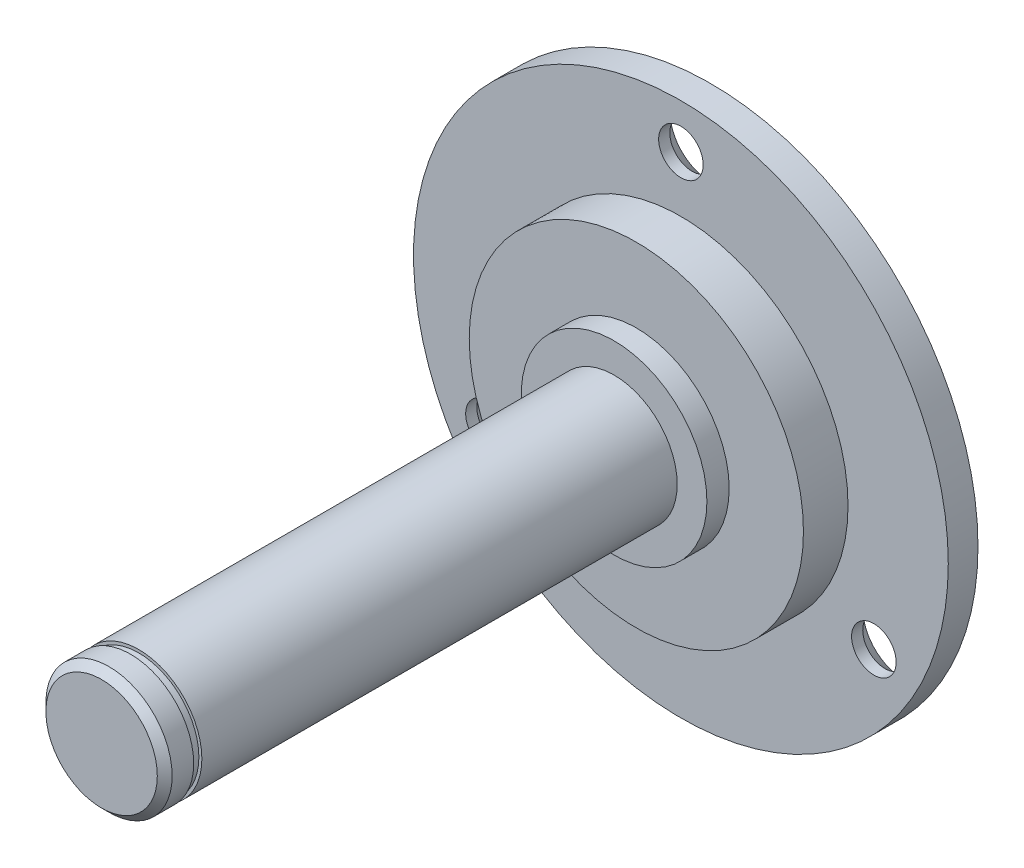
ISO-10303-21;
HEADER;
FILE_DESCRIPTION(('STEP AP214'),'2;1');
FILE_NAME('part.step','',(''),(''),'','','');
FILE_SCHEMA(('AUTOMOTIVE_DESIGN { 1 0 10303 214 1 1 1 1 }'));
ENDSEC;
DATA;
#1=APPLICATION_CONTEXT('core data for automotive mechanical design processes');
#2=APPLICATION_PROTOCOL_DEFINITION('international standard','automotive_design',2000,#1);
#3=PRODUCT_CONTEXT('',#1,'mechanical');
#4=PRODUCT('Part','Part','',(#3));
#5=PRODUCT_RELATED_PRODUCT_CATEGORY('part','',(#4));
#6=PRODUCT_DEFINITION_FORMATION('','',#4);
#7=PRODUCT_DEFINITION_CONTEXT('part definition',#1,'design');
#8=PRODUCT_DEFINITION('design','',#6,#7);
#9=PRODUCT_DEFINITION_SHAPE('','',#8);
#10=(LENGTH_UNIT() NAMED_UNIT(*) SI_UNIT(.MILLI.,.METRE.));
#11=(NAMED_UNIT(*) PLANE_ANGLE_UNIT() SI_UNIT($,.RADIAN.));
#12=(NAMED_UNIT(*) SI_UNIT($,.STERADIAN.) SOLID_ANGLE_UNIT());
#13=UNCERTAINTY_MEASURE_WITH_UNIT(LENGTH_MEASURE(1.E-05),#10,'distance_accuracy_value','');
#14=(GEOMETRIC_REPRESENTATION_CONTEXT(3) GLOBAL_UNCERTAINTY_ASSIGNED_CONTEXT((#13)) GLOBAL_UNIT_ASSIGNED_CONTEXT((#10,
#11,#12)) REPRESENTATION_CONTEXT('',''));
#15=CARTESIAN_POINT('',(0.,0.,0.));
#16=DIRECTION('',(0.,0.,1.));
#17=DIRECTION('',(1.,0.,0.));
#18=AXIS2_PLACEMENT_3D('',#15,#16,#17);
#19=CARTESIAN_POINT('',(0.,0.,0.));
#20=DIRECTION('',(0.,0.,1.));
#21=DIRECTION('',(1.,0.,0.));
#22=AXIS2_PLACEMENT_3D('',#19,#20,#21);
#23=PLANE('',#22);
#24=CARTESIAN_POINT('',(0.,0.,0.));
#25=DIRECTION('',(0.,0.,1.));
#26=DIRECTION('',(1.,0.,0.));
#27=AXIS2_PLACEMENT_3D('',#24,#25,#26);
#28=CIRCLE('',#27,36.);
#29=CARTESIAN_POINT('',(36.,0.,0.));
#30=VERTEX_POINT('',#29);
#31=EDGE_CURVE('E169',#30,#30,#28,.T.);
#32=ORIENTED_EDGE('',*,*,#31,.F.);
#33=EDGE_LOOP('',(#32));
#34=FACE_BOUND('',#33,.T.);
#35=CARTESIAN_POINT('',(-25.9807621135331,-15.0000000000001,0.));
#36=DIRECTION('',(0.,0.,-1.));
#37=DIRECTION('',(-1.,0.,0.));
#38=AXIS2_PLACEMENT_3D('',#35,#36,#37);
#39=CIRCLE('',#38,5.5);
#40=CARTESIAN_POINT('',(-31.4807621135331,-15.0000000000001,0.));
#41=VERTEX_POINT('',#40);
#42=EDGE_CURVE('E134',#41,#41,#39,.T.);
#43=ORIENTED_EDGE('',*,*,#42,.F.);
#44=EDGE_LOOP('',(#43));
#45=FACE_BOUND('',#44,.T.);
#46=CARTESIAN_POINT('',(25.9807621135333,-14.9999999999998,0.));
#47=DIRECTION('',(0.,0.,-1.));
#48=DIRECTION('',(-1.,0.,0.));
#49=AXIS2_PLACEMENT_3D('',#46,#47,#48);
#50=CIRCLE('',#49,5.5);
#51=CARTESIAN_POINT('',(20.4807621135333,-14.9999999999998,0.));
#52=VERTEX_POINT('',#51);
#53=EDGE_CURVE('E125',#52,#52,#50,.T.);
#54=ORIENTED_EDGE('',*,*,#53,.F.);
#55=EDGE_LOOP('',(#54));
#56=FACE_BOUND('',#55,.T.);
#57=CARTESIAN_POINT('',(0.,30.,0.));
#58=DIRECTION('',(0.,0.,-1.));
#59=DIRECTION('',(-1.,0.,0.));
#60=AXIS2_PLACEMENT_3D('',#57,#58,#59);
#61=CIRCLE('',#60,5.5);
#62=CARTESIAN_POINT('',(-5.5,30.,0.));
#63=VERTEX_POINT('',#62);
#64=EDGE_CURVE('E113',#63,#63,#61,.T.);
#65=ORIENTED_EDGE('',*,*,#64,.F.);
#66=EDGE_LOOP('',(#65));
#67=FACE_BOUND('',#66,.T.);
#68=ADVANCED_FACE('F43',(#34,#45,#56,#67),#23,.F.);
#69=CARTESIAN_POINT('',(0.,0.,4.));
#70=DIRECTION('',(0.,0.,-1.));
#71=DIRECTION('',(-1.,0.,0.));
#72=AXIS2_PLACEMENT_3D('',#69,#70,#71);
#73=CYLINDRICAL_SURFACE('',#72,36.);
#74=CARTESIAN_POINT('',(0.,0.,4.));
#75=DIRECTION('',(0.,0.,1.));
#76=DIRECTION('',(1.,0.,0.));
#77=AXIS2_PLACEMENT_3D('',#74,#75,#76);
#78=CIRCLE('',#77,36.);
#79=CARTESIAN_POINT('',(36.,0.,4.));
#80=VERTEX_POINT('',#79);
#81=EDGE_CURVE('E172',#80,#80,#78,.T.);
#82=ORIENTED_EDGE('',*,*,#81,.F.);
#83=EDGE_LOOP('',(#82));
#84=FACE_BOUND('',#83,.T.);
#85=ORIENTED_EDGE('',*,*,#31,.T.);
#86=EDGE_LOOP('',(#85));
#87=FACE_BOUND('',#86,.T.);
#88=ADVANCED_FACE('F257',(#84,#87),#73,.T.);
#89=CARTESIAN_POINT('',(0.,0.,4.));
#90=DIRECTION('',(0.,0.,1.));
#91=DIRECTION('',(1.,0.,0.));
#92=AXIS2_PLACEMENT_3D('',#89,#90,#91);
#93=PLANE('',#92);
#94=CARTESIAN_POINT('',(0.,30.,4.));
#95=DIRECTION('',(0.,0.,1.));
#96=DIRECTION('',(1.,0.,0.));
#97=AXIS2_PLACEMENT_3D('',#94,#95,#96);
#98=CIRCLE('',#97,3.);
#99=CARTESIAN_POINT('',(3.,30.,4.));
#100=VERTEX_POINT('',#99);
#101=EDGE_CURVE('E122',#100,#100,#98,.T.);
#102=ORIENTED_EDGE('',*,*,#101,.F.);
#103=EDGE_LOOP('',(#102));
#104=FACE_BOUND('',#103,.T.);
#105=CARTESIAN_POINT('',(25.9807621135333,-14.9999999999998,4.));
#106=DIRECTION('',(0.,0.,1.));
#107=DIRECTION('',(1.,0.,0.));
#108=AXIS2_PLACEMENT_3D('',#105,#106,#107);
#109=CIRCLE('',#108,3.);
#110=CARTESIAN_POINT('',(28.9807621135333,-14.9999999999998,4.));
#111=VERTEX_POINT('',#110);
#112=EDGE_CURVE('E131',#111,#111,#109,.T.);
#113=ORIENTED_EDGE('',*,*,#112,.F.);
#114=EDGE_LOOP('',(#113));
#115=FACE_BOUND('',#114,.T.);
#116=CARTESIAN_POINT('',(-25.9807621135331,-15.0000000000001,4.));
#117=DIRECTION('',(0.,0.,1.));
#118=DIRECTION('',(1.,0.,0.));
#119=AXIS2_PLACEMENT_3D('',#116,#117,#118);
#120=CIRCLE('',#119,3.);
#121=CARTESIAN_POINT('',(-22.9807621135331,-15.0000000000001,4.));
#122=VERTEX_POINT('',#121);
#123=EDGE_CURVE('E140',#122,#122,#120,.T.);
#124=ORIENTED_EDGE('',*,*,#123,.F.);
#125=EDGE_LOOP('',(#124));
#126=FACE_BOUND('',#125,.T.);
#127=CARTESIAN_POINT('',(0.,0.,4.));
#128=DIRECTION('',(0.,0.,1.));
#129=DIRECTION('',(1.,0.,0.));
#130=AXIS2_PLACEMENT_3D('',#127,#128,#129);
#131=CIRCLE('',#130,22.5);
#132=CARTESIAN_POINT('',(22.5,0.,4.));
#133=VERTEX_POINT('',#132);
#134=EDGE_CURVE('E166',#133,#133,#131,.T.);
#135=ORIENTED_EDGE('',*,*,#134,.F.);
#136=EDGE_LOOP('',(#135));
#137=FACE_BOUND('',#136,.T.);
#138=ORIENTED_EDGE('',*,*,#81,.T.);
#139=EDGE_LOOP('',(#138));
#140=FACE_BOUND('',#139,.T.);
#141=ADVANCED_FACE('F265',(#104,#115,#126,#137,#140),#93,.T.);
#142=CARTESIAN_POINT('',(0.,0.,10.));
#143=DIRECTION('',(0.,0.,-1.));
#144=DIRECTION('',(-1.,0.,0.));
#145=AXIS2_PLACEMENT_3D('',#142,#143,#144);
#146=CYLINDRICAL_SURFACE('',#145,22.5);
#147=CARTESIAN_POINT('',(0.,0.,10.));
#148=DIRECTION('',(0.,0.,1.));
#149=DIRECTION('',(1.,0.,0.));
#150=AXIS2_PLACEMENT_3D('',#147,#148,#149);
#151=CIRCLE('',#150,22.5);
#152=CARTESIAN_POINT('',(22.5,0.,10.));
#153=VERTEX_POINT('',#152);
#154=EDGE_CURVE('E163',#153,#153,#151,.T.);
#155=ORIENTED_EDGE('',*,*,#154,.F.);
#156=EDGE_LOOP('',(#155));
#157=FACE_BOUND('',#156,.T.);
#158=ORIENTED_EDGE('',*,*,#134,.T.);
#159=EDGE_LOOP('',(#158));
#160=FACE_BOUND('',#159,.T.);
#161=ADVANCED_FACE('F271',(#157,#160),#146,.T.);
#162=CARTESIAN_POINT('',(0.,0.,10.));
#163=DIRECTION('',(0.,0.,1.));
#164=DIRECTION('',(1.,0.,0.));
#165=AXIS2_PLACEMENT_3D('',#162,#163,#164);
#166=PLANE('',#165);
#167=CARTESIAN_POINT('',(0.,0.,10.));
#168=DIRECTION('',(0.,0.,1.));
#169=DIRECTION('',(1.,0.,0.));
#170=AXIS2_PLACEMENT_3D('',#167,#168,#169);
#171=CIRCLE('',#170,12.5);
#172=CARTESIAN_POINT('',(12.5,0.,10.));
#173=VERTEX_POINT('',#172);
#174=EDGE_CURVE('E160',#173,#173,#171,.T.);
#175=ORIENTED_EDGE('',*,*,#174,.F.);
#176=EDGE_LOOP('',(#175));
#177=FACE_BOUND('',#176,.T.);
#178=ORIENTED_EDGE('',*,*,#154,.T.);
#179=EDGE_LOOP('',(#178));
#180=FACE_BOUND('',#179,.T.);
#181=ADVANCED_FACE('F275',(#177,#180),#166,.T.);
#182=CARTESIAN_POINT('',(0.,0.,13.));
#183=DIRECTION('',(0.,0.,-1.));
#184=DIRECTION('',(-1.,0.,0.));
#185=AXIS2_PLACEMENT_3D('',#182,#183,#184);
#186=CYLINDRICAL_SURFACE('',#185,12.5);
#187=CARTESIAN_POINT('',(0.,0.,13.));
#188=DIRECTION('',(0.,0.,1.));
#189=DIRECTION('',(1.,0.,0.));
#190=AXIS2_PLACEMENT_3D('',#187,#188,#189);
#191=CIRCLE('',#190,12.5);
#192=CARTESIAN_POINT('',(12.5,0.,13.));
#193=VERTEX_POINT('',#192);
#194=EDGE_CURVE('E157',#193,#193,#191,.T.);
#195=ORIENTED_EDGE('',*,*,#194,.F.);
#196=EDGE_LOOP('',(#195));
#197=FACE_BOUND('',#196,.T.);
#198=ORIENTED_EDGE('',*,*,#174,.T.);
#199=EDGE_LOOP('',(#198));
#200=FACE_BOUND('',#199,.T.);
#201=ADVANCED_FACE('F279',(#197,#200),#186,.T.);
#202=CARTESIAN_POINT('',(0.,0.,13.));
#203=DIRECTION('',(0.,0.,1.));
#204=DIRECTION('',(1.,0.,0.));
#205=AXIS2_PLACEMENT_3D('',#202,#203,#204);
#206=PLANE('',#205);
#207=CARTESIAN_POINT('',(0.,0.,13.));
#208=DIRECTION('',(0.,0.,1.));
#209=DIRECTION('',(1.,0.,0.));
#210=AXIS2_PLACEMENT_3D('',#207,#208,#209);
#211=CIRCLE('',#210,8.5);
#212=CARTESIAN_POINT('',(8.5,0.,13.));
#213=VERTEX_POINT('',#212);
#214=EDGE_CURVE('E154',#213,#213,#211,.T.);
#215=ORIENTED_EDGE('',*,*,#214,.F.);
#216=EDGE_LOOP('',(#215));
#217=FACE_BOUND('',#216,.T.);
#218=ORIENTED_EDGE('',*,*,#194,.T.);
#219=EDGE_LOOP('',(#218));
#220=FACE_BOUND('',#219,.T.);
#221=ADVANCED_FACE('F252',(#217,#220),#206,.T.);
#222=CARTESIAN_POINT('',(0.,0.,77.));
#223=DIRECTION('',(0.,0.,-1.));
#224=DIRECTION('',(-1.,0.,0.));
#225=AXIS2_PLACEMENT_3D('',#222,#223,#224);
#226=CYLINDRICAL_SURFACE('',#225,8.5);
#227=DIRECTION('',(0.,0.,-1.));
#228=VECTOR('',#227,1.);
#229=CARTESIAN_POINT('',(-8.12403840463596,2.5,77.));
#230=LINE('',#229,#228);
#231=CARTESIAN_POINT('',(-8.12403840463597,2.5,57.5));
#232=VERTEX_POINT('',#231);
#233=CARTESIAN_POINT('',(-8.12403840463596,2.5,72.5));
#234=VERTEX_POINT('',#233);
#235=EDGE_CURVE('E58',#232,#234,#230,.F.);
#236=ORIENTED_EDGE('',*,*,#235,.T.);
#237=CARTESIAN_POINT('',(-8.12403840463597,2.5,72.5));
#238=CARTESIAN_POINT('',(-8.12402906918788,2.50000849482375,72.5686798740165));
#239=CARTESIAN_POINT('',(-8.12490911076693,2.49717000278527,72.6373543550343));
#240=CARTESIAN_POINT('',(-8.12837858671624,2.48586511968106,72.7741805441502));
#241=CARTESIAN_POINT('',(-8.13096764928693,2.47739995270244,72.8423323626926));
#242=CARTESIAN_POINT('',(-8.13777747849977,2.45493539721691,72.9774651852462));
#243=CARTESIAN_POINT('',(-8.14199421689239,2.44094966934028,73.0444486563169));
#244=CARTESIAN_POINT('',(-8.15192355487623,2.40758038109888,73.1769261224908));
#245=CARTESIAN_POINT('',(-8.15763619117327,2.38819668828001,73.2424200810019));
#246=CARTESIAN_POINT('',(-8.17677139859334,2.32218333516284,73.4359466577163));
#247=CARTESIAN_POINT('',(-8.19220032894025,2.26766331260792,73.5611911443731));
#248=CARTESIAN_POINT('',(-8.22665400749432,2.13928827038699,73.8007525002289));
#249=CARTESIAN_POINT('',(-8.24568033865688,2.06542473351158,73.9150645253735));
#250=CARTESIAN_POINT('',(-8.28582980304436,1.89805567552886,74.1330227536414));
#251=CARTESIAN_POINT('',(-8.30699606932742,1.80406793699746,74.2362914557574));
#252=CARTESIAN_POINT('',(-8.3486723067775,1.60015164255653,74.4258512308676));
#253=CARTESIAN_POINT('',(-8.36918216745793,1.49022042007658,74.5121394581522));
#254=CARTESIAN_POINT('',(-8.40772509439061,1.25484557022573,74.6669298144631));
#255=CARTESIAN_POINT('',(-8.4257010652051,1.12913784642323,74.735045858621));
#256=CARTESIAN_POINT('',(-8.45664705558546,0.867439712870041,74.8490219915756));
#257=CARTESIAN_POINT('',(-8.46961832661638,0.731451883926504,74.8948876449987));
#258=CARTESIAN_POINT('',(-8.48878775104765,0.457025436042512,74.9618125975809));
#259=CARTESIAN_POINT('',(-8.49516267663223,0.31875758104749,74.9835205659233));
#260=CARTESIAN_POINT('',(-8.50104290465192,0.0404023337326084,75.0035631669422));
#261=CARTESIAN_POINT('',(-8.50054945212903,-0.0996847242177955,75.0019020357725));
#262=CARTESIAN_POINT('',(-8.49287404903277,-0.373152065700695,74.9756920726157));
#263=CARTESIAN_POINT('',(-8.48589741931878,-0.506606351501284,74.9518458124474));
#264=CARTESIAN_POINT('',(-8.46628787386658,-0.767526211609397,74.8830881283723));
#265=CARTESIAN_POINT('',(-8.45365466599277,-0.89499147623648,74.8381756164872));
#266=CARTESIAN_POINT('',(-8.42386367197651,-1.14201050505989,74.7280728830861));
#267=CARTESIAN_POINT('',(-8.40665607251673,-1.26145783196649,74.6626579008713));
#268=CARTESIAN_POINT('',(-8.36954730631605,-1.48790576816497,74.5135844050676));
#269=CARTESIAN_POINT('',(-8.34964555974157,-1.59490368885599,74.4299219618899));
#270=CARTESIAN_POINT('',(-8.3084133766687,-1.79760092163623,74.2430791868332));
#271=CARTESIAN_POINT('',(-8.28705732485783,-1.89273539157049,74.1392910095942));
#272=CARTESIAN_POINT('',(-8.24596689824959,-2.06442395091057,73.9169959430954));
#273=CARTESIAN_POINT('',(-8.22623299169097,-2.14097268784055,73.798484828619));
#274=CARTESIAN_POINT('',(-8.19049726651393,-2.27388499803613,73.5486482102345));
#275=CARTESIAN_POINT('',(-8.17453234339792,-2.33005169701786,73.4172125416657));
#276=CARTESIAN_POINT('',(-8.14859211524143,-2.41922275200857,73.1462427316992));
#277=CARTESIAN_POINT('',(-8.13860768891974,-2.45226239378342,73.006721280827));
#278=CARTESIAN_POINT('',(-8.1295316440969,-2.48209216527632,72.8049224206918));
#279=CARTESIAN_POINT('',(-8.12747604590249,-2.48880708529662,72.7441046608776));
#280=CARTESIAN_POINT('',(-8.12472934803225,-2.49775684694221,72.6222014669268));
#281=CARTESIAN_POINT('',(-8.1240362093203,-2.49999838344215,72.5611165701191));
#282=CARTESIAN_POINT('',(-8.12403840463596,-2.5,72.5));
#283=B_SPLINE_CURVE_WITH_KNOTS('',3,(#237,#238,#239,#240,#241,#242,#243,#244,#245,#246,#247,
#248,#249,#250,#251,#252,#253,#254,#255,#256,#257,#258,#259,#260,#261,#262,#263,#264,#265,#266,
#267,#268,#269,#270,#271,#272,#273,#274,#275,#276,#277,#278,#279,#280,#281,#282),.UNSPECIFIED.,
.F.,.F.,(4,2,2,2,2,2,2,2,2,2,2,2,2,2,2,2,2,2,2,2,2,2,4),(0.,0.205966154303675,0.411887515184556,
0.617302486138783,0.822722497965402,1.23305966556148,1.64357781480005,2.06533049675581,
2.48715379896954,2.91733102657663,3.3474006151165,3.76562050724646,4.18376458896797,
4.58910158908383,4.9944595253604,5.40442657694558,5.81448200221468,6.2397161669572,
6.66507264934229,7.09443475825321,7.52314033790763,7.70665727258005,7.88989934885716),.UNSPECIFIED.);
#284=CARTESIAN_POINT('',(-8.12403840463596,-2.5,72.5));
#285=VERTEX_POINT('',#284);
#286=EDGE_CURVE('E12',#234,#285,#283,.T.);
#287=ORIENTED_EDGE('',*,*,#286,.T.);
#288=DIRECTION('',(0.,0.,-1.));
#289=VECTOR('',#288,1.);
#290=CARTESIAN_POINT('',(-8.12403840463596,-2.5,77.));
#291=LINE('',#290,#289);
#292=CARTESIAN_POINT('',(-8.12403840463596,-2.5,57.5));
#293=VERTEX_POINT('',#292);
#294=EDGE_CURVE('E92',#285,#293,#291,.T.);
#295=ORIENTED_EDGE('',*,*,#294,.T.);
#296=CARTESIAN_POINT('',(-8.12403840463597,-2.5,57.5));
#297=CARTESIAN_POINT('',(-8.12402906918788,-2.50000849482375,57.4313201259835));
#298=CARTESIAN_POINT('',(-8.12490911076693,-2.49717000278527,57.3626456449657));
#299=CARTESIAN_POINT('',(-8.12837858671625,-2.48586511968106,57.2258194558498));
#300=CARTESIAN_POINT('',(-8.13096764928693,-2.47739995270244,57.1576676373074));
#301=CARTESIAN_POINT('',(-8.13777747849977,-2.4549353972169,57.0225348147538));
#302=CARTESIAN_POINT('',(-8.14199421689239,-2.44094966934028,56.9555513436831));
#303=CARTESIAN_POINT('',(-8.15192355487623,-2.40758038109888,56.8230738775092));
#304=CARTESIAN_POINT('',(-8.15763619117327,-2.38819668828,56.7575799189981));
#305=CARTESIAN_POINT('',(-8.17677139859334,-2.32218333516284,56.5640533422837));
#306=CARTESIAN_POINT('',(-8.19220032894025,-2.26766331260792,56.4388088556269));
#307=CARTESIAN_POINT('',(-8.22665400749432,-2.13928827038699,56.1992474997711));
#308=CARTESIAN_POINT('',(-8.24568033865688,-2.06542473351158,56.0849354746265));
#309=CARTESIAN_POINT('',(-8.28582980304436,-1.89805567552886,55.8669772463586));
#310=CARTESIAN_POINT('',(-8.30699606932741,-1.80406793699746,55.7637085442427));
#311=CARTESIAN_POINT('',(-8.3486723067775,-1.60015164255654,55.5741487691324));
#312=CARTESIAN_POINT('',(-8.36918216745793,-1.49022042007658,55.4878605418478));
#313=CARTESIAN_POINT('',(-8.40772509439061,-1.25484557022573,55.3330701855369));
#314=CARTESIAN_POINT('',(-8.4257010652051,-1.12913784642324,55.264954141379));
#315=CARTESIAN_POINT('',(-8.45664705558546,-0.867439712870039,55.1509780084245));
#316=CARTESIAN_POINT('',(-8.46961832661638,-0.731451883926501,55.1051123550013));
#317=CARTESIAN_POINT('',(-8.48878775104765,-0.457025436042509,55.0381874024191));
#318=CARTESIAN_POINT('',(-8.49516267663223,-0.318757581047488,55.0164794340767));
#319=CARTESIAN_POINT('',(-8.50104290465192,-0.0404023337326057,54.9964368330578));
#320=CARTESIAN_POINT('',(-8.50054945212903,0.0996847242177986,54.9980979642275));
#321=CARTESIAN_POINT('',(-8.49287404903277,0.373152065700698,55.0243079273843));
#322=CARTESIAN_POINT('',(-8.48589741931878,0.506606351501287,55.0481541875526));
#323=CARTESIAN_POINT('',(-8.46628787386658,0.767526211609399,55.1169118716277));
#324=CARTESIAN_POINT('',(-8.45365466599277,0.894991476236481,55.1618243835128));
#325=CARTESIAN_POINT('',(-8.42386367197651,1.14201050505989,55.2719271169139));
#326=CARTESIAN_POINT('',(-8.40665607251673,1.26145783196648,55.3373420991287));
#327=CARTESIAN_POINT('',(-8.36954730631605,1.48790576816497,55.4864155949324));
#328=CARTESIAN_POINT('',(-8.34964555974157,1.59490368885599,55.5700780381101));
#329=CARTESIAN_POINT('',(-8.3084133766687,1.79760092163622,55.7569208131668));
#330=CARTESIAN_POINT('',(-8.28705732485783,1.89273539157048,55.8607089904058));
#331=CARTESIAN_POINT('',(-8.24596689824959,2.06442395091056,56.0830040569046));
#332=CARTESIAN_POINT('',(-8.22623299169098,2.14097268784054,56.201515171381));
#333=CARTESIAN_POINT('',(-8.19049726651393,2.27388499803613,56.4513517897655));
#334=CARTESIAN_POINT('',(-8.17453234339792,2.33005169701786,56.5827874583343));
#335=CARTESIAN_POINT('',(-8.14859211524143,2.41922275200858,56.8537572683008));
#336=CARTESIAN_POINT('',(-8.13860768891974,2.45226239378342,56.9932787191731));
#337=CARTESIAN_POINT('',(-8.1295316440969,2.48209216527632,57.1950775793082));
#338=CARTESIAN_POINT('',(-8.12747604590249,2.48880708529662,57.2558953391224));
#339=CARTESIAN_POINT('',(-8.12472934803225,2.49775684694221,57.3777985330732));
#340=CARTESIAN_POINT('',(-8.1240362093203,2.49999838344215,57.4388834298809));
#341=CARTESIAN_POINT('',(-8.12403840463596,2.5,57.5));
#342=B_SPLINE_CURVE_WITH_KNOTS('',3,(#296,#297,#298,#299,#300,#301,#302,#303,#304,#305,#306,
#307,#308,#309,#310,#311,#312,#313,#314,#315,#316,#317,#318,#319,#320,#321,#322,#323,#324,#325,
#326,#327,#328,#329,#330,#331,#332,#333,#334,#335,#336,#337,#338,#339,#340,#341),.UNSPECIFIED.,
.F.,.F.,(4,2,2,2,2,2,2,2,2,2,2,2,2,2,2,2,2,2,2,2,2,2,4),(0.,0.205966154303668,0.411887515184563,
0.617302486138797,0.822722497965402,1.23305966556148,1.64357781480006,2.0653304967558,
2.48715379896953,2.91733102657664,3.3474006151165,3.76562050724646,4.18376458896797,
4.58910158908383,4.9944595253604,5.40442657694558,5.81448200221468,6.23971616695719,
6.66507264934228,7.09443475825321,7.52314033790765,7.70665727258005,7.88989934885714),.UNSPECIFIED.);
#343=EDGE_CURVE('E183',#293,#232,#342,.T.);
#344=ORIENTED_EDGE('',*,*,#343,.T.);
#345=EDGE_LOOP('',(#236,#287,#295,#344));
#346=FACE_BOUND('',#345,.T.);
#347=CARTESIAN_POINT('',(0.,0.,77.));
#348=DIRECTION('',(0.,0.,1.));
#349=DIRECTION('',(1.,0.,0.));
#350=AXIS2_PLACEMENT_3D('',#347,#348,#349);
#351=CIRCLE('',#350,8.5);
#352=CARTESIAN_POINT('',(8.5,0.,77.));
#353=VERTEX_POINT('',#352);
#354=EDGE_CURVE('E149',#353,#353,#351,.T.);
#355=ORIENTED_EDGE('',*,*,#354,.F.);
#356=EDGE_LOOP('',(#355));
#357=FACE_BOUND('',#356,.T.);
#358=ORIENTED_EDGE('',*,*,#214,.T.);
#359=EDGE_LOOP('',(#358));
#360=FACE_BOUND('',#359,.T.);
#361=ADVANCED_FACE('F190',(#346,#357,#360),#226,.T.);
#362=CARTESIAN_POINT('',(0.,0.,77.));
#363=DIRECTION('',(0.,0.,1.));
#364=DIRECTION('',(1.,0.,0.));
#365=AXIS2_PLACEMENT_3D('',#362,#363,#364);
#366=PLANE('',#365);
#367=CARTESIAN_POINT('',(0.,0.,77.));
#368=DIRECTION('',(0.,0.,1.));
#369=DIRECTION('',(1.,0.,0.));
#370=AXIS2_PLACEMENT_3D('',#367,#368,#369);
#371=CIRCLE('',#370,8.1);
#372=CARTESIAN_POINT('',(8.1,0.,77.));
#373=VERTEX_POINT('',#372);
#374=EDGE_CURVE('E150',#373,#373,#371,.T.);
#375=ORIENTED_EDGE('',*,*,#374,.F.);
#376=EDGE_LOOP('',(#375));
#377=FACE_BOUND('',#376,.T.);
#378=ORIENTED_EDGE('',*,*,#354,.T.);
#379=EDGE_LOOP('',(#378));
#380=FACE_BOUND('',#379,.T.);
#381=ADVANCED_FACE('F244',(#377,#380),#366,.T.);
#382=CARTESIAN_POINT('',(0.,0.,78.1));
#383=DIRECTION('',(0.,0.,-1.));
#384=DIRECTION('',(-1.,0.,0.));
#385=AXIS2_PLACEMENT_3D('',#382,#383,#384);
#386=CYLINDRICAL_SURFACE('',#385,8.1);
#387=CARTESIAN_POINT('',(0.,0.,78.1));
#388=DIRECTION('',(0.,0.,1.));
#389=DIRECTION('',(1.,0.,0.));
#390=AXIS2_PLACEMENT_3D('',#387,#388,#389);
#391=CIRCLE('',#390,8.1);
#392=CARTESIAN_POINT('',(8.1,0.,78.1));
#393=VERTEX_POINT('',#392);
#394=EDGE_CURVE('E146',#393,#393,#391,.T.);
#395=ORIENTED_EDGE('',*,*,#394,.F.);
#396=EDGE_LOOP('',(#395));
#397=FACE_BOUND('',#396,.T.);
#398=ORIENTED_EDGE('',*,*,#374,.T.);
#399=EDGE_LOOP('',(#398));
#400=FACE_BOUND('',#399,.T.);
#401=ADVANCED_FACE('F238',(#397,#400),#386,.T.);
#402=CARTESIAN_POINT('',(0.,0.,188.041630560343));
#403=DIRECTION('',(0.,0.,-1.));
#404=DIRECTION('',(-1.,0.,0.));
#405=AXIS2_PLACEMENT_3D('',#402,#403,#404);
#406=CYLINDRICAL_SURFACE('',#405,8.5);
#407=CARTESIAN_POINT('',(0.,0.,81.));
#408=DIRECTION('',(0.,0.,1.));
#409=DIRECTION('',(1.,0.,0.));
#410=AXIS2_PLACEMENT_3D('',#407,#408,#409);
#411=CIRCLE('',#410,8.5);
#412=CARTESIAN_POINT('',(8.5,0.,81.));
#413=VERTEX_POINT('',#412);
#414=EDGE_CURVE('E179',#413,#413,#411,.F.);
#415=ORIENTED_EDGE('',*,*,#414,.T.);
#416=EDGE_LOOP('',(#415));
#417=FACE_BOUND('',#416,.T.);
#418=CARTESIAN_POINT('',(0.,0.,78.1));
#419=DIRECTION('',(0.,0.,1.));
#420=DIRECTION('',(1.,0.,0.));
#421=AXIS2_PLACEMENT_3D('',#418,#419,#420);
#422=CIRCLE('',#421,8.5);
#423=CARTESIAN_POINT('',(8.5,0.,78.1));
#424=VERTEX_POINT('',#423);
#425=EDGE_CURVE('E143',#424,#424,#422,.T.);
#426=ORIENTED_EDGE('',*,*,#425,.T.);
#427=EDGE_LOOP('',(#426));
#428=FACE_BOUND('',#427,.T.);
#429=ADVANCED_FACE('F234',(#417,#428),#406,.T.);
#430=CARTESIAN_POINT('',(0.,0.,78.1));
#431=DIRECTION('',(0.,0.,1.));
#432=DIRECTION('',(1.,0.,0.));
#433=AXIS2_PLACEMENT_3D('',#430,#431,#432);
#434=PLANE('',#433);
#435=ORIENTED_EDGE('',*,*,#394,.T.);
#436=EDGE_LOOP('',(#435));
#437=FACE_BOUND('',#436,.T.);
#438=ORIENTED_EDGE('',*,*,#425,.F.);
#439=EDGE_LOOP('',(#438));
#440=FACE_BOUND('',#439,.T.);
#441=ADVANCED_FACE('F230',(#437,#440),#434,.F.);
#442=CARTESIAN_POINT('',(0.,0.,82.));
#443=DIRECTION('',(0.,0.,1.));
#444=DIRECTION('',(1.,0.,0.));
#445=AXIS2_PLACEMENT_3D('',#442,#443,#444);
#446=PLANE('',#445);
#447=CARTESIAN_POINT('',(0.,0.,82.));
#448=DIRECTION('',(0.,0.,1.));
#449=DIRECTION('',(1.,0.,0.));
#450=AXIS2_PLACEMENT_3D('',#447,#448,#449);
#451=CIRCLE('',#450,7.49999999999999);
#452=CARTESIAN_POINT('',(7.49999999999999,0.,82.));
#453=VERTEX_POINT('',#452);
#454=EDGE_CURVE('E153',#453,#453,#451,.T.);
#455=ORIENTED_EDGE('',*,*,#454,.T.);
#456=EDGE_LOOP('',(#455));
#457=FACE_BOUND('',#456,.T.);
#458=ADVANCED_FACE('F233',(#457),#446,.T.);
#459=CARTESIAN_POINT('',(0.,0.,82.));
#460=DIRECTION('',(0.,0.,-1.));
#461=DIRECTION('',(-1.,0.,0.));
#462=AXIS2_PLACEMENT_3D('',#459,#460,#461);
#463=CONICAL_SURFACE('',#462,7.49999999999999,0.785398163397444);
#464=ORIENTED_EDGE('',*,*,#414,.F.);
#465=EDGE_LOOP('',(#464));
#466=FACE_BOUND('',#465,.T.);
#467=ORIENTED_EDGE('',*,*,#454,.F.);
#468=EDGE_LOOP('',(#467));
#469=FACE_BOUND('',#468,.T.);
#470=ADVANCED_FACE('F46',(#466,#469),#463,.T.);
#471=CARTESIAN_POINT('',(-25.9807621135331,-15.0000000000001,0.));
#472=DIRECTION('',(0.,0.,-1.));
#473=DIRECTION('',(-1.,0.,0.));
#474=AXIS2_PLACEMENT_3D('',#471,#472,#473);
#475=CYLINDRICAL_SURFACE('',#474,3.);
#476=CARTESIAN_POINT('',(-25.9807621135331,-15.0000000000001,2.5));
#477=DIRECTION('',(0.,0.,-1.));
#478=DIRECTION('',(-1.,0.,0.));
#479=AXIS2_PLACEMENT_3D('',#476,#477,#478);
#480=CIRCLE('',#479,3.);
#481=CARTESIAN_POINT('',(-28.9807621135331,-15.0000000000001,2.5));
#482=VERTEX_POINT('',#481);
#483=EDGE_CURVE('E137',#482,#482,#480,.T.);
#484=ORIENTED_EDGE('',*,*,#483,.T.);
#485=EDGE_LOOP('',(#484));
#486=FACE_BOUND('',#485,.T.);
#487=ORIENTED_EDGE('',*,*,#123,.T.);
#488=EDGE_LOOP('',(#487));
#489=FACE_BOUND('',#488,.T.);
#490=ADVANCED_FACE('F225',(#486,#489),#475,.F.);
#491=CARTESIAN_POINT('',(-25.9807621135331,-15.0000000000001,0.));
#492=DIRECTION('',(0.,0.,-1.));
#493=DIRECTION('',(-1.,0.,0.));
#494=AXIS2_PLACEMENT_3D('',#491,#492,#493);
#495=CONICAL_SURFACE('',#494,5.5,0.785398163397449);
#496=ORIENTED_EDGE('',*,*,#483,.F.);
#497=EDGE_LOOP('',(#496));
#498=FACE_BOUND('',#497,.T.);
#499=ORIENTED_EDGE('',*,*,#42,.T.);
#500=EDGE_LOOP('',(#499));
#501=FACE_BOUND('',#500,.T.);
#502=ADVANCED_FACE('F221',(#498,#501),#495,.F.);
#503=CARTESIAN_POINT('',(25.9807621135333,-14.9999999999998,0.));
#504=DIRECTION('',(0.,0.,-1.));
#505=DIRECTION('',(-1.,0.,0.));
#506=AXIS2_PLACEMENT_3D('',#503,#504,#505);
#507=CYLINDRICAL_SURFACE('',#506,3.);
#508=CARTESIAN_POINT('',(25.9807621135333,-14.9999999999998,2.5));
#509=DIRECTION('',(0.,0.,-1.));
#510=DIRECTION('',(-1.,0.,0.));
#511=AXIS2_PLACEMENT_3D('',#508,#509,#510);
#512=CIRCLE('',#511,3.);
#513=CARTESIAN_POINT('',(22.9807621135333,-14.9999999999998,2.5));
#514=VERTEX_POINT('',#513);
#515=EDGE_CURVE('E128',#514,#514,#512,.T.);
#516=ORIENTED_EDGE('',*,*,#515,.T.);
#517=EDGE_LOOP('',(#516));
#518=FACE_BOUND('',#517,.T.);
#519=ORIENTED_EDGE('',*,*,#112,.T.);
#520=EDGE_LOOP('',(#519));
#521=FACE_BOUND('',#520,.T.);
#522=ADVANCED_FACE('F217',(#518,#521),#507,.F.);
#523=CARTESIAN_POINT('',(25.9807621135333,-14.9999999999998,0.));
#524=DIRECTION('',(0.,0.,-1.));
#525=DIRECTION('',(-1.,0.,0.));
#526=AXIS2_PLACEMENT_3D('',#523,#524,#525);
#527=CONICAL_SURFACE('',#526,5.5,0.785398163397449);
#528=ORIENTED_EDGE('',*,*,#515,.F.);
#529=EDGE_LOOP('',(#528));
#530=FACE_BOUND('',#529,.T.);
#531=ORIENTED_EDGE('',*,*,#53,.T.);
#532=EDGE_LOOP('',(#531));
#533=FACE_BOUND('',#532,.T.);
#534=ADVANCED_FACE('F213',(#530,#533),#527,.F.);
#535=CARTESIAN_POINT('',(0.,30.,0.));
#536=DIRECTION('',(0.,0.,-1.));
#537=DIRECTION('',(-1.,0.,0.));
#538=AXIS2_PLACEMENT_3D('',#535,#536,#537);
#539=CYLINDRICAL_SURFACE('',#538,3.);
#540=CARTESIAN_POINT('',(0.,30.,2.5));
#541=DIRECTION('',(0.,0.,-1.));
#542=DIRECTION('',(-1.,0.,0.));
#543=AXIS2_PLACEMENT_3D('',#540,#541,#542);
#544=CIRCLE('',#543,3.);
#545=CARTESIAN_POINT('',(-3.,30.,2.5));
#546=VERTEX_POINT('',#545);
#547=EDGE_CURVE('E119',#546,#546,#544,.T.);
#548=ORIENTED_EDGE('',*,*,#547,.T.);
#549=EDGE_LOOP('',(#548));
#550=FACE_BOUND('',#549,.T.);
#551=ORIENTED_EDGE('',*,*,#101,.T.);
#552=EDGE_LOOP('',(#551));
#553=FACE_BOUND('',#552,.T.);
#554=ADVANCED_FACE('F209',(#550,#553),#539,.F.);
#555=CARTESIAN_POINT('',(0.,30.,0.));
#556=DIRECTION('',(0.,0.,-1.));
#557=DIRECTION('',(-1.,0.,0.));
#558=AXIS2_PLACEMENT_3D('',#555,#556,#557);
#559=CONICAL_SURFACE('',#558,5.5,0.785398163397449);
#560=ORIENTED_EDGE('',*,*,#547,.F.);
#561=EDGE_LOOP('',(#560));
#562=FACE_BOUND('',#561,.T.);
#563=ORIENTED_EDGE('',*,*,#64,.T.);
#564=EDGE_LOOP('',(#563));
#565=FACE_BOUND('',#564,.T.);
#566=ADVANCED_FACE('F206',(#562,#565),#559,.F.);
#567=CARTESIAN_POINT('',(-36.,0.,72.5));
#568=DIRECTION('',(1.,0.,0.));
#569=DIRECTION('',(0.,0.,-1.));
#570=AXIS2_PLACEMENT_3D('',#567,#568,#569);
#571=CYLINDRICAL_SURFACE('',#570,2.5);
#572=DIRECTION('',(1.,0.,0.));
#573=VECTOR('',#572,1.);
#574=CARTESIAN_POINT('',(-36.,2.5,72.5));
#575=LINE('',#574,#573);
#576=CARTESIAN_POINT('',(-5.5,2.5,72.5));
#577=VERTEX_POINT('',#576);
#578=EDGE_CURVE('E107',#234,#577,#575,.T.);
#579=ORIENTED_EDGE('',*,*,#578,.T.);
#580=CARTESIAN_POINT('',(-5.5,0.,72.5));
#581=DIRECTION('',(1.,0.,0.));
#582=DIRECTION('',(0.,0.,-1.));
#583=AXIS2_PLACEMENT_3D('',#580,#581,#582);
#584=CIRCLE('',#583,2.5);
#585=CARTESIAN_POINT('',(-5.5,-2.5,72.5));
#586=VERTEX_POINT('',#585);
#587=EDGE_CURVE('E101',#577,#586,#584,.T.);
#588=ORIENTED_EDGE('',*,*,#587,.T.);
#589=DIRECTION('',(1.,0.,0.));
#590=VECTOR('',#589,1.);
#591=CARTESIAN_POINT('',(-36.,-2.5,72.5));
#592=LINE('',#591,#590);
#593=EDGE_CURVE('E87',#285,#586,#592,.T.);
#594=ORIENTED_EDGE('',*,*,#593,.F.);
#595=ORIENTED_EDGE('',*,*,#286,.F.);
#596=EDGE_LOOP('',(#579,#588,#594,#595));
#597=FACE_BOUND('',#596,.T.);
#598=ADVANCED_FACE('F106',(#597),#571,.F.);
#599=CARTESIAN_POINT('',(-36.,2.5,72.5));
#600=DIRECTION('',(0.,1.,0.));
#601=DIRECTION('',(0.,0.,1.));
#602=AXIS2_PLACEMENT_3D('',#599,#600,#601);
#603=PLANE('',#602);
#604=DIRECTION('',(1.,0.,0.));
#605=VECTOR('',#604,1.);
#606=CARTESIAN_POINT('',(-36.,2.5,57.5));
#607=LINE('',#606,#605);
#608=CARTESIAN_POINT('',(-5.5,2.5,57.5));
#609=VERTEX_POINT('',#608);
#610=EDGE_CURVE('E114',#232,#609,#607,.T.);
#611=ORIENTED_EDGE('',*,*,#610,.T.);
#612=DIRECTION('',(0.,0.,1.));
#613=VECTOR('',#612,1.);
#614=CARTESIAN_POINT('',(-5.5,2.5,72.5));
#615=LINE('',#614,#613);
#616=EDGE_CURVE('E94',#609,#577,#615,.T.);
#617=ORIENTED_EDGE('',*,*,#616,.T.);
#618=ORIENTED_EDGE('',*,*,#578,.F.);
#619=ORIENTED_EDGE('',*,*,#235,.F.);
#620=EDGE_LOOP('',(#611,#617,#618,#619));
#621=FACE_BOUND('',#620,.T.);
#622=ADVANCED_FACE('F199',(#621),#603,.F.);
#623=CARTESIAN_POINT('',(-36.,0.,57.5));
#624=DIRECTION('',(1.,0.,0.));
#625=DIRECTION('',(0.,0.,-1.));
#626=AXIS2_PLACEMENT_3D('',#623,#624,#625);
#627=CYLINDRICAL_SURFACE('',#626,2.5);
#628=DIRECTION('',(1.,0.,0.));
#629=VECTOR('',#628,1.);
#630=CARTESIAN_POINT('',(-36.,-2.5,57.5));
#631=LINE('',#630,#629);
#632=CARTESIAN_POINT('',(-5.5,-2.5,57.5));
#633=VERTEX_POINT('',#632);
#634=EDGE_CURVE('E65',#293,#633,#631,.T.);
#635=ORIENTED_EDGE('',*,*,#634,.T.);
#636=CARTESIAN_POINT('',(-5.5,0.,57.5));
#637=DIRECTION('',(1.,0.,0.));
#638=DIRECTION('',(0.,0.,-1.));
#639=AXIS2_PLACEMENT_3D('',#636,#637,#638);
#640=CIRCLE('',#639,2.5);
#641=EDGE_CURVE('E104',#633,#609,#640,.T.);
#642=ORIENTED_EDGE('',*,*,#641,.T.);
#643=ORIENTED_EDGE('',*,*,#610,.F.);
#644=ORIENTED_EDGE('',*,*,#343,.F.);
#645=EDGE_LOOP('',(#635,#642,#643,#644));
#646=FACE_BOUND('',#645,.T.);
#647=ADVANCED_FACE('F194',(#646),#627,.F.);
#648=CARTESIAN_POINT('',(-36.,-2.5,72.5));
#649=DIRECTION('',(0.,-1.,0.));
#650=DIRECTION('',(0.,0.,-1.));
#651=AXIS2_PLACEMENT_3D('',#648,#649,#650);
#652=PLANE('',#651);
#653=ORIENTED_EDGE('',*,*,#593,.T.);
#654=DIRECTION('',(0.,0.,-1.));
#655=VECTOR('',#654,1.);
#656=CARTESIAN_POINT('',(-5.5,-2.5,72.5));
#657=LINE('',#656,#655);
#658=EDGE_CURVE('E90',#586,#633,#657,.T.);
#659=ORIENTED_EDGE('',*,*,#658,.T.);
#660=ORIENTED_EDGE('',*,*,#634,.F.);
#661=ORIENTED_EDGE('',*,*,#294,.F.);
#662=EDGE_LOOP('',(#653,#659,#660,#661));
#663=FACE_BOUND('',#662,.T.);
#664=ADVANCED_FACE('F89',(#663),#652,.F.);
#665=CARTESIAN_POINT('',(-5.5,0.,72.5));
#666=DIRECTION('',(1.,0.,0.));
#667=DIRECTION('',(0.,0.,-1.));
#668=AXIS2_PLACEMENT_3D('',#665,#666,#667);
#669=PLANE('',#668);
#670=ORIENTED_EDGE('',*,*,#587,.F.);
#671=ORIENTED_EDGE('',*,*,#616,.F.);
#672=ORIENTED_EDGE('',*,*,#641,.F.);
#673=ORIENTED_EDGE('',*,*,#658,.F.);
#674=EDGE_LOOP('',(#670,#671,#672,#673));
#675=FACE_BOUND('',#674,.T.);
#676=ADVANCED_FACE('F99',(#675),#669,.F.);
#677=CLOSED_SHELL('',(#68,#88,#141,#161,#181,#201,#221,#361,#381,#401,#429,#441,#458,#470,#490,
#502,#522,#534,#554,#566,#598,#622,#647,#664,#676));
#678=MANIFOLD_SOLID_BREP('B2',#677);
#679=ADVANCED_BREP_SHAPE_REPRESENTATION('',(#18,#678),#14);
#680=SHAPE_DEFINITION_REPRESENTATION(#9,#679);
ENDSEC;
END-ISO-10303-21;
